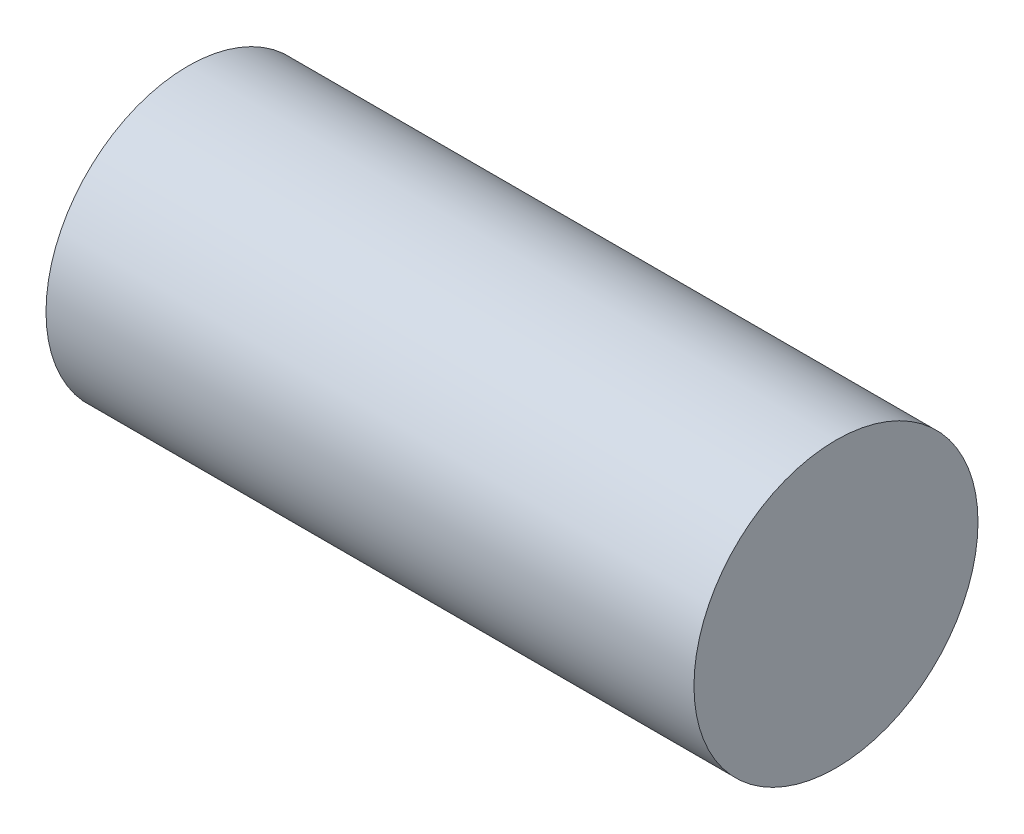
ISO-10303-21;
HEADER;
FILE_DESCRIPTION(('STEP AP214'),'2;1');
FILE_NAME('part.step','',(''),(''),'','','');
FILE_SCHEMA(('AUTOMOTIVE_DESIGN { 1 0 10303 214 1 1 1 1 }'));
ENDSEC;
DATA;
#1=APPLICATION_CONTEXT('core data for automotive mechanical design processes');
#2=APPLICATION_PROTOCOL_DEFINITION('international standard','automotive_design',2000,#1);
#3=PRODUCT_CONTEXT('',#1,'mechanical');
#4=PRODUCT('Part','Part','',(#3));
#5=PRODUCT_RELATED_PRODUCT_CATEGORY('part','',(#4));
#6=PRODUCT_DEFINITION_FORMATION('','',#4);
#7=PRODUCT_DEFINITION_CONTEXT('part definition',#1,'design');
#8=PRODUCT_DEFINITION('design','',#6,#7);
#9=PRODUCT_DEFINITION_SHAPE('','',#8);
#10=(LENGTH_UNIT() NAMED_UNIT(*) SI_UNIT(.MILLI.,.METRE.));
#11=(NAMED_UNIT(*) PLANE_ANGLE_UNIT() SI_UNIT($,.RADIAN.));
#12=(NAMED_UNIT(*) SI_UNIT($,.STERADIAN.) SOLID_ANGLE_UNIT());
#13=UNCERTAINTY_MEASURE_WITH_UNIT(LENGTH_MEASURE(1.E-05),#10,'distance_accuracy_value','');
#14=(GEOMETRIC_REPRESENTATION_CONTEXT(3) GLOBAL_UNCERTAINTY_ASSIGNED_CONTEXT((#13)) GLOBAL_UNIT_ASSIGNED_CONTEXT((#10,
#11,#12)) REPRESENTATION_CONTEXT('',''));
#15=CARTESIAN_POINT('',(0.,0.,0.));
#16=DIRECTION('',(0.,0.,1.));
#17=DIRECTION('',(1.,0.,0.));
#18=AXIS2_PLACEMENT_3D('',#15,#16,#17);
#19=CARTESIAN_POINT('',(173.8376,0.,0.));
#20=DIRECTION('',(-1.,0.,0.));
#21=DIRECTION('',(0.,0.,1.));
#22=AXIS2_PLACEMENT_3D('',#19,#20,#21);
#23=CYLINDRICAL_SURFACE('',#22,38.1);
#24=CARTESIAN_POINT('',(173.8376,0.,0.));
#25=DIRECTION('',(1.,0.,0.));
#26=DIRECTION('',(0.,0.,-1.));
#27=AXIS2_PLACEMENT_3D('',#24,#25,#26);
#28=CIRCLE('',#27,38.1);
#29=CARTESIAN_POINT('',(173.8376,0.,38.1));
#30=VERTEX_POINT('',#29);
#31=EDGE_CURVE('E10',#30,#30,#28,.T.);
#32=CARTESIAN_POINT('',(0.,0.,0.));
#33=DIRECTION('',(1.,0.,0.));
#34=DIRECTION('',(0.,0.,-1.));
#35=AXIS2_PLACEMENT_3D('',#32,#33,#34);
#36=CIRCLE('',#35,38.1);
#37=CARTESIAN_POINT('',(0.,0.,38.1));
#38=VERTEX_POINT('',#37);
#39=EDGE_CURVE('E34',#38,#38,#36,.T.);
#40=CARTESIAN_POINT('',(173.8376,0.,38.1));
#41=CARTESIAN_POINT('',(172.026791666667,0.,38.1));
#42=CARTESIAN_POINT('',(170.215983333333,0.,38.1));
#43=CARTESIAN_POINT('',(166.594366666667,0.,38.1));
#44=CARTESIAN_POINT('',(164.783558333333,0.,38.1));
#45=CARTESIAN_POINT('',(161.161941666667,0.,38.1));
#46=CARTESIAN_POINT('',(159.351133333333,0.,38.1));
#47=CARTESIAN_POINT('',(155.729516666667,0.,38.1));
#48=CARTESIAN_POINT('',(153.918708333333,0.,38.1));
#49=CARTESIAN_POINT('',(150.297091666667,0.,38.1));
#50=CARTESIAN_POINT('',(148.486283333333,0.,38.1));
#51=CARTESIAN_POINT('',(144.864666666667,0.,38.1));
#52=CARTESIAN_POINT('',(143.053858333333,0.,38.1));
#53=CARTESIAN_POINT('',(139.432241666667,0.,38.1));
#54=CARTESIAN_POINT('',(137.621433333333,0.,38.1));
#55=CARTESIAN_POINT('',(133.999816666667,0.,38.1));
#56=CARTESIAN_POINT('',(132.189008333333,0.,38.1));
#57=CARTESIAN_POINT('',(128.567391666667,0.,38.1));
#58=CARTESIAN_POINT('',(126.756583333333,0.,38.1));
#59=CARTESIAN_POINT('',(123.134966666667,0.,38.1));
#60=CARTESIAN_POINT('',(121.324158333333,0.,38.1));
#61=CARTESIAN_POINT('',(117.702541666667,0.,38.1));
#62=CARTESIAN_POINT('',(115.891733333333,0.,38.1));
#63=CARTESIAN_POINT('',(112.270116666667,0.,38.1));
#64=CARTESIAN_POINT('',(110.459308333333,0.,38.1));
#65=CARTESIAN_POINT('',(106.837691666667,0.,38.1));
#66=CARTESIAN_POINT('',(105.026883333333,0.,38.1));
#67=CARTESIAN_POINT('',(101.405266666667,0.,38.1));
#68=CARTESIAN_POINT('',(99.5944583333333,0.,38.1));
#69=CARTESIAN_POINT('',(95.9728416666667,0.,38.1));
#70=CARTESIAN_POINT('',(94.1620333333333,0.,38.1));
#71=CARTESIAN_POINT('',(90.5404166666667,0.,38.1));
#72=CARTESIAN_POINT('',(88.7296083333333,0.,38.1));
#73=CARTESIAN_POINT('',(85.1079916666667,0.,38.1));
#74=CARTESIAN_POINT('',(83.2971833333333,0.,38.1));
#75=CARTESIAN_POINT('',(79.6755666666667,0.,38.1));
#76=CARTESIAN_POINT('',(77.8647583333333,0.,38.1));
#77=CARTESIAN_POINT('',(74.2431416666666,0.,38.1));
#78=CARTESIAN_POINT('',(72.4323333333333,0.,38.1));
#79=CARTESIAN_POINT('',(68.8107166666667,0.,38.1));
#80=CARTESIAN_POINT('',(66.9999083333333,0.,38.1));
#81=CARTESIAN_POINT('',(63.3782916666667,0.,38.1));
#82=CARTESIAN_POINT('',(61.5674833333333,0.,38.1));
#83=CARTESIAN_POINT('',(57.9458666666667,0.,38.1));
#84=CARTESIAN_POINT('',(56.1350583333333,0.,38.1));
#85=CARTESIAN_POINT('',(52.5134416666667,0.,38.1));
#86=CARTESIAN_POINT('',(50.7026333333333,0.,38.1));
#87=CARTESIAN_POINT('',(47.0810166666667,0.,38.1));
#88=CARTESIAN_POINT('',(45.2702083333333,0.,38.1));
#89=CARTESIAN_POINT('',(41.6485916666667,0.,38.1));
#90=CARTESIAN_POINT('',(39.8377833333333,0.,38.1));
#91=CARTESIAN_POINT('',(36.2161666666667,0.,38.1));
#92=CARTESIAN_POINT('',(34.4053583333333,0.,38.1));
#93=CARTESIAN_POINT('',(30.7837416666667,0.,38.1));
#94=CARTESIAN_POINT('',(28.9729333333333,0.,38.1));
#95=CARTESIAN_POINT('',(25.3513166666667,0.,38.1));
#96=CARTESIAN_POINT('',(23.5405083333333,0.,38.1));
#97=CARTESIAN_POINT('',(19.9188916666667,0.,38.1));
#98=CARTESIAN_POINT('',(18.1080833333333,0.,38.1));
#99=CARTESIAN_POINT('',(14.4864666666667,0.,38.1));
#100=CARTESIAN_POINT('',(12.6756583333333,0.,38.1));
#101=CARTESIAN_POINT('',(9.05404166666667,0.,38.1));
#102=CARTESIAN_POINT('',(7.24323333333333,0.,38.1));
#103=CARTESIAN_POINT('',(3.62161666666666,0.,38.1));
#104=CARTESIAN_POINT('',(1.81080833333333,0.,38.1));
#105=CARTESIAN_POINT('',(0.,0.,38.1));
#106=B_SPLINE_CURVE_WITH_KNOTS('',3,(#40,#41,#42,#43,#44,#45,#46,#47,#48,#49,#50,#51,#52,#53,
#54,#55,#56,#57,#58,#59,#60,#61,#62,#63,#64,#65,#66,#67,#68,#69,#70,#71,#72,#73,#74,#75,#76,#77,
#78,#79,#80,#81,#82,#83,#84,#85,#86,#87,#88,#89,#90,#91,#92,#93,#94,#95,#96,#97,#98,#99,#100,
#101,#102,#103,#104,#105),.UNSPECIFIED.,.F.,.F.,(4,2,2,2,2,2,2,2,2,2,2,2,2,2,2,2,2,2,2,2,2,2,2,
2,2,2,2,2,2,2,2,2,4),(0.,5.43242500000002,10.86485,16.297275,21.7297,27.162125,32.59455,
38.026975,43.4594,48.891825,54.32425,59.756675,65.1891,70.621525,76.05395,81.486375,86.9188,
92.351225,97.78365,103.216075,108.6485,114.080925,119.51335,124.945775,130.3782,135.810625,
141.24305,146.675475,152.1079,157.540325,162.97275,168.405175,173.8376),.UNSPECIFIED.);
#107=EDGE_CURVE('BSEAM31',#30,#38,#106,.T.);
#108=ORIENTED_EDGE('',*,*,#31,.F.);
#109=ORIENTED_EDGE('',*,*,#39,.T.);
#110=ORIENTED_EDGE('',*,*,#107,.T.);
#111=ORIENTED_EDGE('',*,*,#107,.F.);
#112=EDGE_LOOP('',(#108,#110,#109,#111));
#113=FACE_BOUND('',#112,.T.);
#114=ADVANCED_FACE('F31',(#113),#23,.T.);
#115=CARTESIAN_POINT('',(173.8376,0.,0.));
#116=DIRECTION('',(1.,0.,0.));
#117=DIRECTION('',(0.,0.,-1.));
#118=AXIS2_PLACEMENT_3D('',#115,#116,#117);
#119=PLANE('',#118);
#120=ORIENTED_EDGE('',*,*,#31,.T.);
#121=EDGE_LOOP('',(#120));
#122=FACE_BOUND('',#121,.T.);
#123=ADVANCED_FACE('F46',(#122),#119,.T.);
#124=CARTESIAN_POINT('',(0.,0.,0.));
#125=DIRECTION('',(1.,0.,0.));
#126=DIRECTION('',(0.,0.,-1.));
#127=AXIS2_PLACEMENT_3D('',#124,#125,#126);
#128=PLANE('',#127);
#129=ORIENTED_EDGE('',*,*,#39,.F.);
#130=EDGE_LOOP('',(#129));
#131=FACE_BOUND('',#130,.T.);
#132=ADVANCED_FACE('F44',(#131),#128,.F.);
#133=CLOSED_SHELL('',(#114,#123,#132));
#134=MANIFOLD_SOLID_BREP('B2',#133);
#135=ADVANCED_BREP_SHAPE_REPRESENTATION('',(#18,#134),#14);
#136=SHAPE_DEFINITION_REPRESENTATION(#9,#135);
ENDSEC;
END-ISO-10303-21;
